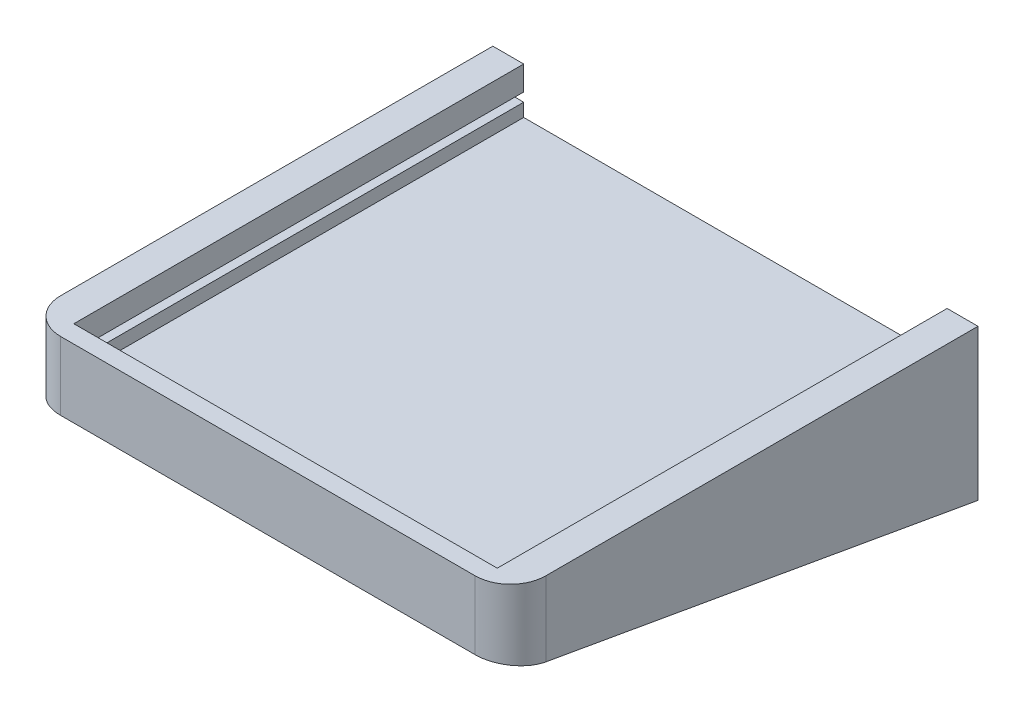
ISO-10303-21;
HEADER;
FILE_DESCRIPTION(('STEP AP214'),'2;1');
FILE_NAME('part.step','',(''),(''),'','','');
FILE_SCHEMA(('AUTOMOTIVE_DESIGN { 1 0 10303 214 1 1 1 1 }'));
ENDSEC;
DATA;
#1=APPLICATION_CONTEXT('core data for automotive mechanical design processes');
#2=APPLICATION_PROTOCOL_DEFINITION('international standard','automotive_design',2000,#1);
#3=PRODUCT_CONTEXT('',#1,'mechanical');
#4=PRODUCT('Part','Part','',(#3));
#5=PRODUCT_RELATED_PRODUCT_CATEGORY('part','',(#4));
#6=PRODUCT_DEFINITION_FORMATION('','',#4);
#7=PRODUCT_DEFINITION_CONTEXT('part definition',#1,'design');
#8=PRODUCT_DEFINITION('design','',#6,#7);
#9=PRODUCT_DEFINITION_SHAPE('','',#8);
#10=(LENGTH_UNIT() NAMED_UNIT(*) SI_UNIT(.MILLI.,.METRE.));
#11=(NAMED_UNIT(*) PLANE_ANGLE_UNIT() SI_UNIT($,.RADIAN.));
#12=(NAMED_UNIT(*) SI_UNIT($,.STERADIAN.) SOLID_ANGLE_UNIT());
#13=UNCERTAINTY_MEASURE_WITH_UNIT(LENGTH_MEASURE(1.E-05),#10,'distance_accuracy_value','');
#14=(GEOMETRIC_REPRESENTATION_CONTEXT(3) GLOBAL_UNCERTAINTY_ASSIGNED_CONTEXT((#13)) GLOBAL_UNIT_ASSIGNED_CONTEXT((#10,
#11,#12)) REPRESENTATION_CONTEXT('',''));
#15=CARTESIAN_POINT('',(0.,0.,0.));
#16=DIRECTION('',(0.,0.,1.));
#17=DIRECTION('',(1.,0.,0.));
#18=AXIS2_PLACEMENT_3D('',#15,#16,#17);
#19=CARTESIAN_POINT('',(0.,8.,0.));
#20=DIRECTION('',(0.,1.,0.));
#21=DIRECTION('',(0.,0.,1.));
#22=AXIS2_PLACEMENT_3D('',#19,#20,#21);
#23=PLANE('',#22);
#24=DIRECTION('',(-1.,0.,0.));
#25=VECTOR('',#24,1.);
#26=CARTESIAN_POINT('',(0.,8.,-106.));
#27=LINE('',#26,#25);
#28=CARTESIAN_POINT('',(7.00000000000001,8.,-106.));
#29=VERTEX_POINT('',#28);
#30=CARTESIAN_POINT('',(4.00000000000002,8.,-106.));
#31=VERTEX_POINT('',#30);
#32=EDGE_CURVE('E376',#29,#31,#27,.T.);
#33=ORIENTED_EDGE('',*,*,#32,.T.);
#34=DIRECTION('',(0.,0.,1.));
#35=VECTOR('',#34,1.);
#36=CARTESIAN_POINT('',(4.00000000000001,8.,-106.));
#37=LINE('',#36,#35);
#38=CARTESIAN_POINT('',(4.00000000000002,8.,-4.));
#39=VERTEX_POINT('',#38);
#40=EDGE_CURVE('E343',#31,#39,#37,.T.);
#41=ORIENTED_EDGE('',*,*,#40,.T.);
#42=DIRECTION('',(1.,0.,0.));
#43=VECTOR('',#42,1.);
#44=CARTESIAN_POINT('',(4.00000000000002,8.,-4.));
#45=LINE('',#44,#43);
#46=CARTESIAN_POINT('',(7.00000000000001,8.,-4.));
#47=VERTEX_POINT('',#46);
#48=EDGE_CURVE('E353',#39,#47,#45,.T.);
#49=ORIENTED_EDGE('',*,*,#48,.T.);
#50=DIRECTION('',(0.,0.,1.));
#51=VECTOR('',#50,1.);
#52=CARTESIAN_POINT('',(7.00000000000001,8.,0.));
#53=LINE('',#52,#51);
#54=EDGE_CURVE('E372',#29,#47,#53,.T.);
#55=ORIENTED_EDGE('',*,*,#54,.F.);
#56=EDGE_LOOP('',(#33,#41,#49,#55));
#57=FACE_BOUND('',#56,.T.);
#58=ADVANCED_FACE('F43',(#57),#23,.T.);
#59=DIRECTION('',(0.,0.,-1.));
#60=VECTOR('',#59,1.);
#61=CARTESIAN_POINT('',(103.,8.,0.));
#62=LINE('',#61,#60);
#63=CARTESIAN_POINT('',(103.,8.,-4.));
#64=VERTEX_POINT('',#63);
#65=CARTESIAN_POINT('',(103.,8.,-106.));
#66=VERTEX_POINT('',#65);
#67=EDGE_CURVE('E369',#64,#66,#62,.T.);
#68=ORIENTED_EDGE('',*,*,#67,.F.);
#69=CARTESIAN_POINT('',(106.,8.,-4.));
#70=VERTEX_POINT('',#69);
#71=EDGE_CURVE('E355',#64,#70,#45,.T.);
#72=ORIENTED_EDGE('',*,*,#71,.T.);
#73=DIRECTION('',(0.,0.,1.));
#74=VECTOR('',#73,1.);
#75=CARTESIAN_POINT('',(106.,8.,-106.));
#76=LINE('',#75,#74);
#77=CARTESIAN_POINT('',(106.,8.,-106.));
#78=VERTEX_POINT('',#77);
#79=EDGE_CURVE('E339',#78,#70,#76,.T.);
#80=ORIENTED_EDGE('',*,*,#79,.F.);
#81=EDGE_CURVE('E378',#78,#66,#27,.T.);
#82=ORIENTED_EDGE('',*,*,#81,.T.);
#83=EDGE_LOOP('',(#68,#72,#80,#82));
#84=FACE_BOUND('',#83,.T.);
#85=ADVANCED_FACE('F461',(#84),#23,.T.);
#86=CARTESIAN_POINT('',(0.,5.,0.));
#87=DIRECTION('',(1.,0.,0.));
#88=DIRECTION('',(0.,0.,-1.));
#89=AXIS2_PLACEMENT_3D('',#86,#87,#88);
#90=PLANE('',#89);
#91=DIRECTION('',(0.,-0.173648177666923,-0.984807753012209));
#92=VECTOR('',#91,1.);
#93=CARTESIAN_POINT('',(0.,-18.6906599550965,-106.));
#94=LINE('',#93,#92);
#95=CARTESIAN_POINT('',(0.,-1.41061584566766,-7.99999999999999));
#96=VERTEX_POINT('',#95);
#97=CARTESIAN_POINT('',(0.,-18.6906599550965,-106.));
#98=VERTEX_POINT('',#97);
#99=EDGE_CURVE('E294',#96,#98,#94,.T.);
#100=ORIENTED_EDGE('',*,*,#99,.F.);
#101=DIRECTION('',(0.,-1.,0.));
#102=VECTOR('',#101,1.);
#103=CARTESIAN_POINT('',(0.,5.,-8.));
#104=LINE('',#103,#102);
#105=CARTESIAN_POINT('',(0.,15.5,-7.99999999999999));
#106=VERTEX_POINT('',#105);
#107=EDGE_CURVE('E67',#96,#106,#104,.F.);
#108=ORIENTED_EDGE('',*,*,#107,.T.);
#109=DIRECTION('',(0.,0.,1.));
#110=VECTOR('',#109,1.);
#111=CARTESIAN_POINT('',(0.,15.5,-106.));
#112=LINE('',#111,#110);
#113=CARTESIAN_POINT('',(0.,15.5,-106.));
#114=VERTEX_POINT('',#113);
#115=EDGE_CURVE('E301',#114,#106,#112,.T.);
#116=ORIENTED_EDGE('',*,*,#115,.F.);
#117=DIRECTION('',(0.,-1.,0.));
#118=VECTOR('',#117,1.);
#119=CARTESIAN_POINT('',(0.,5.,-106.));
#120=LINE('',#119,#118);
#121=EDGE_CURVE('E399',#114,#98,#120,.T.);
#122=ORIENTED_EDGE('',*,*,#121,.T.);
#123=EDGE_LOOP('',(#100,#108,#116,#122));
#124=FACE_BOUND('',#123,.T.);
#125=ADVANCED_FACE('F468',(#124),#90,.F.);
#126=CARTESIAN_POINT('',(0.,5.,0.));
#127=DIRECTION('',(0.,0.,-1.));
#128=DIRECTION('',(-1.,0.,0.));
#129=AXIS2_PLACEMENT_3D('',#126,#127,#128);
#130=PLANE('',#129);
#131=DIRECTION('',(1.,0.,0.));
#132=VECTOR('',#131,1.);
#133=CARTESIAN_POINT('',(0.,0.,0.));
#134=LINE('',#133,#132);
#135=CARTESIAN_POINT('',(8.,0.,0.));
#136=VERTEX_POINT('',#135);
#137=CARTESIAN_POINT('',(102.,0.,0.));
#138=VERTEX_POINT('',#137);
#139=EDGE_CURVE('E395',#136,#138,#134,.T.);
#140=ORIENTED_EDGE('',*,*,#139,.T.);
#141=DIRECTION('',(0.,-1.,0.));
#142=VECTOR('',#141,1.);
#143=CARTESIAN_POINT('',(102.,5.,0.));
#144=LINE('',#143,#142);
#145=CARTESIAN_POINT('',(102.,15.5,0.));
#146=VERTEX_POINT('',#145);
#147=EDGE_CURVE('E417',#138,#146,#144,.F.);
#148=ORIENTED_EDGE('',*,*,#147,.T.);
#149=DIRECTION('',(1.,0.,0.));
#150=VECTOR('',#149,1.);
#151=CARTESIAN_POINT('',(110.,15.5,0.));
#152=LINE('',#151,#150);
#153=CARTESIAN_POINT('',(7.99999999999999,15.5,0.));
#154=VERTEX_POINT('',#153);
#155=EDGE_CURVE('E303',#154,#146,#152,.T.);
#156=ORIENTED_EDGE('',*,*,#155,.F.);
#157=DIRECTION('',(0.,-1.,0.));
#158=VECTOR('',#157,1.);
#159=CARTESIAN_POINT('',(8.,5.,0.));
#160=LINE('',#159,#158);
#161=EDGE_CURVE('E414',#154,#136,#160,.T.);
#162=ORIENTED_EDGE('',*,*,#161,.T.);
#163=EDGE_LOOP('',(#140,#148,#156,#162));
#164=FACE_BOUND('',#163,.T.);
#165=ADVANCED_FACE('F494',(#164),#130,.F.);
#166=CARTESIAN_POINT('',(110.,5.,0.));
#167=DIRECTION('',(-1.,0.,0.));
#168=DIRECTION('',(0.,0.,1.));
#169=AXIS2_PLACEMENT_3D('',#166,#167,#168);
#170=PLANE('',#169);
#171=DIRECTION('',(0.,0.,-1.));
#172=VECTOR('',#171,1.);
#173=CARTESIAN_POINT('',(110.,15.5,0.));
#174=LINE('',#173,#172);
#175=CARTESIAN_POINT('',(110.,15.5,-8.));
#176=VERTEX_POINT('',#175);
#177=CARTESIAN_POINT('',(110.,15.5,-106.));
#178=VERTEX_POINT('',#177);
#179=EDGE_CURVE('E307',#176,#178,#174,.T.);
#180=ORIENTED_EDGE('',*,*,#179,.F.);
#181=DIRECTION('',(0.,-1.,0.));
#182=VECTOR('',#181,1.);
#183=CARTESIAN_POINT('',(110.,5.,-8.));
#184=LINE('',#183,#182);
#185=CARTESIAN_POINT('',(110.,-1.41061584566766,-7.99999999999999));
#186=VERTEX_POINT('',#185);
#187=EDGE_CURVE('E407',#176,#186,#184,.T.);
#188=ORIENTED_EDGE('',*,*,#187,.T.);
#189=DIRECTION('',(0.,-0.173648177666923,-0.984807753012209));
#190=VECTOR('',#189,1.);
#191=CARTESIAN_POINT('',(110.,-18.6906599550965,-106.));
#192=LINE('',#191,#190);
#193=CARTESIAN_POINT('',(110.,-18.6906599550965,-106.));
#194=VERTEX_POINT('',#193);
#195=EDGE_CURVE('E291',#186,#194,#192,.T.);
#196=ORIENTED_EDGE('',*,*,#195,.T.);
#197=DIRECTION('',(0.,-1.,0.));
#198=VECTOR('',#197,1.);
#199=CARTESIAN_POINT('',(110.,5.,-106.));
#200=LINE('',#199,#198);
#201=EDGE_CURVE('E404',#178,#194,#200,.T.);
#202=ORIENTED_EDGE('',*,*,#201,.F.);
#203=EDGE_LOOP('',(#180,#188,#196,#202));
#204=FACE_BOUND('',#203,.T.);
#205=ADVANCED_FACE('F491',(#204),#170,.F.);
#206=CARTESIAN_POINT('',(0.,5.,-106.));
#207=DIRECTION('',(0.,0.,1.));
#208=DIRECTION('',(1.,0.,0.));
#209=AXIS2_PLACEMENT_3D('',#206,#207,#208);
#210=PLANE('',#209);
#211=CARTESIAN_POINT('',(103.,0.,-106.));
#212=DIRECTION('',(0.,0.,1.));
#213=DIRECTION('',(1.,0.,0.));
#214=AXIS2_PLACEMENT_3D('',#211,#212,#213);
#215=CIRCLE('',#214,2.85000000000001);
#216=CARTESIAN_POINT('',(105.85,0.,-106.));
#217=VERTEX_POINT('',#216);
#218=EDGE_CURVE('E52',#217,#217,#215,.T.);
#219=ORIENTED_EDGE('',*,*,#218,.T.);
#220=EDGE_LOOP('',(#219));
#221=FACE_BOUND('',#220,.T.);
#222=CARTESIAN_POINT('',(7.00000000000001,0.,-106.));
#223=DIRECTION('',(0.,0.,1.));
#224=DIRECTION('',(1.,0.,0.));
#225=AXIS2_PLACEMENT_3D('',#222,#223,#224);
#226=CIRCLE('',#225,2.85000000000001);
#227=CARTESIAN_POINT('',(9.85000000000001,0.,-106.));
#228=VERTEX_POINT('',#227);
#229=EDGE_CURVE('E427',#228,#228,#226,.T.);
#230=ORIENTED_EDGE('',*,*,#229,.T.);
#231=EDGE_LOOP('',(#230));
#232=FACE_BOUND('',#231,.T.);
#233=ORIENTED_EDGE('',*,*,#201,.T.);
#234=DIRECTION('',(1.,0.,0.));
#235=VECTOR('',#234,1.);
#236=CARTESIAN_POINT('',(0.,-18.6906599550965,-106.));
#237=LINE('',#236,#235);
#238=EDGE_CURVE('E296',#98,#194,#237,.T.);
#239=ORIENTED_EDGE('',*,*,#238,.F.);
#240=ORIENTED_EDGE('',*,*,#121,.F.);
#241=DIRECTION('',(-1.,0.,0.));
#242=VECTOR('',#241,1.);
#243=CARTESIAN_POINT('',(0.,15.5,-106.));
#244=LINE('',#243,#242);
#245=CARTESIAN_POINT('',(7.00000000000001,15.5,-106.));
#246=VERTEX_POINT('',#245);
#247=EDGE_CURVE('E317',#246,#114,#244,.T.);
#248=ORIENTED_EDGE('',*,*,#247,.F.);
#249=DIRECTION('',(0.,-1.,0.));
#250=VECTOR('',#249,1.);
#251=CARTESIAN_POINT('',(7.00000000000001,15.5,-106.));
#252=LINE('',#251,#250);
#253=CARTESIAN_POINT('',(7.00000000000001,10.,-106.));
#254=VERTEX_POINT('',#253);
#255=EDGE_CURVE('E320',#246,#254,#252,.T.);
#256=ORIENTED_EDGE('',*,*,#255,.T.);
#257=DIRECTION('',(-1.,0.,0.));
#258=VECTOR('',#257,1.);
#259=CARTESIAN_POINT('',(0.,10.,-106.));
#260=LINE('',#259,#258);
#261=CARTESIAN_POINT('',(4.00000000000002,10.,-106.));
#262=VERTEX_POINT('',#261);
#263=EDGE_CURVE('E304',#254,#262,#260,.T.);
#264=ORIENTED_EDGE('',*,*,#263,.T.);
#265=DIRECTION('',(0.,-1.,0.));
#266=VECTOR('',#265,1.);
#267=CARTESIAN_POINT('',(4.00000000000001,10.,-106.));
#268=LINE('',#267,#266);
#269=EDGE_CURVE('E350',#262,#31,#268,.T.);
#270=ORIENTED_EDGE('',*,*,#269,.T.);
#271=ORIENTED_EDGE('',*,*,#32,.F.);
#272=DIRECTION('',(0.,-1.,0.));
#273=VECTOR('',#272,1.);
#274=CARTESIAN_POINT('',(7.00000000000001,8.,-106.));
#275=LINE('',#274,#273);
#276=CARTESIAN_POINT('',(7.00000000000001,5.,-106.));
#277=VERTEX_POINT('',#276);
#278=EDGE_CURVE('E388',#29,#277,#275,.T.);
#279=ORIENTED_EDGE('',*,*,#278,.T.);
#280=DIRECTION('',(-1.,0.,0.));
#281=VECTOR('',#280,1.);
#282=CARTESIAN_POINT('',(0.,5.,-106.));
#283=LINE('',#282,#281);
#284=CARTESIAN_POINT('',(103.,5.,-106.));
#285=VERTEX_POINT('',#284);
#286=EDGE_CURVE('E396',#285,#277,#283,.T.);
#287=ORIENTED_EDGE('',*,*,#286,.F.);
#288=DIRECTION('',(0.,-1.,0.));
#289=VECTOR('',#288,1.);
#290=CARTESIAN_POINT('',(103.,8.,-106.));
#291=LINE('',#290,#289);
#292=EDGE_CURVE('E386',#66,#285,#291,.T.);
#293=ORIENTED_EDGE('',*,*,#292,.F.);
#294=ORIENTED_EDGE('',*,*,#81,.F.);
#295=DIRECTION('',(0.,-1.,0.));
#296=VECTOR('',#295,1.);
#297=CARTESIAN_POINT('',(106.,10.,-106.));
#298=LINE('',#297,#296);
#299=CARTESIAN_POINT('',(106.,10.,-106.));
#300=VERTEX_POINT('',#299);
#301=EDGE_CURVE('E365',#300,#78,#298,.T.);
#302=ORIENTED_EDGE('',*,*,#301,.F.);
#303=DIRECTION('',(-1.,0.,0.));
#304=VECTOR('',#303,1.);
#305=CARTESIAN_POINT('',(103.,10.,-106.));
#306=LINE('',#305,#304);
#307=CARTESIAN_POINT('',(103.,10.,-106.));
#308=VERTEX_POINT('',#307);
#309=EDGE_CURVE('E300',#300,#308,#306,.T.);
#310=ORIENTED_EDGE('',*,*,#309,.T.);
#311=DIRECTION('',(0.,-1.,0.));
#312=VECTOR('',#311,1.);
#313=CARTESIAN_POINT('',(103.,15.5,-106.));
#314=LINE('',#313,#312);
#315=CARTESIAN_POINT('',(103.,15.5,-106.));
#316=VERTEX_POINT('',#315);
#317=EDGE_CURVE('E336',#316,#308,#314,.T.);
#318=ORIENTED_EDGE('',*,*,#317,.F.);
#319=DIRECTION('',(-1.,0.,0.));
#320=VECTOR('',#319,1.);
#321=CARTESIAN_POINT('',(103.,15.5,-106.));
#322=LINE('',#321,#320);
#323=EDGE_CURVE('E309',#178,#316,#322,.T.);
#324=ORIENTED_EDGE('',*,*,#323,.F.);
#325=EDGE_LOOP('',(#233,#239,#240,#248,#256,#264,#270,#271,#279,#287,#293,#294,#302,#310,#318,#324));
#326=FACE_BOUND('',#325,.T.);
#327=ADVANCED_FACE('F432',(#221,#232,#326),#210,.F.);
#328=CARTESIAN_POINT('',(0.,5.,0.));
#329=DIRECTION('',(0.,-1.,0.));
#330=DIRECTION('',(0.,0.,-1.));
#331=AXIS2_PLACEMENT_3D('',#328,#329,#330);
#332=PLANE('',#331);
#333=DIRECTION('',(1.,0.,0.));
#334=VECTOR('',#333,1.);
#335=CARTESIAN_POINT('',(0.,5.,-4.));
#336=LINE('',#335,#334);
#337=CARTESIAN_POINT('',(7.00000000000001,5.,-4.));
#338=VERTEX_POINT('',#337);
#339=CARTESIAN_POINT('',(103.,5.,-4.));
#340=VERTEX_POINT('',#339);
#341=EDGE_CURVE('E381',#338,#340,#336,.T.);
#342=ORIENTED_EDGE('',*,*,#341,.T.);
#343=DIRECTION('',(0.,0.,-1.));
#344=VECTOR('',#343,1.);
#345=CARTESIAN_POINT('',(103.,5.,0.));
#346=LINE('',#345,#344);
#347=EDGE_CURVE('E368',#340,#285,#346,.T.);
#348=ORIENTED_EDGE('',*,*,#347,.T.);
#349=ORIENTED_EDGE('',*,*,#286,.T.);
#350=DIRECTION('',(0.,0.,1.));
#351=VECTOR('',#350,1.);
#352=CARTESIAN_POINT('',(7.00000000000001,5.,0.));
#353=LINE('',#352,#351);
#354=EDGE_CURVE('E373',#277,#338,#353,.T.);
#355=ORIENTED_EDGE('',*,*,#354,.T.);
#356=EDGE_LOOP('',(#342,#348,#349,#355));
#357=FACE_BOUND('',#356,.T.);
#358=ADVANCED_FACE('F485',(#357),#332,.F.);
#359=CARTESIAN_POINT('',(103.,8.,0.));
#360=DIRECTION('',(-1.,0.,0.));
#361=DIRECTION('',(0.,0.,1.));
#362=AXIS2_PLACEMENT_3D('',#359,#360,#361);
#363=PLANE('',#362);
#364=ORIENTED_EDGE('',*,*,#347,.F.);
#365=DIRECTION('',(0.,-1.,0.));
#366=VECTOR('',#365,1.);
#367=CARTESIAN_POINT('',(103.,8.,-4.));
#368=LINE('',#367,#366);
#369=EDGE_CURVE('E392',#64,#340,#368,.T.);
#370=ORIENTED_EDGE('',*,*,#369,.F.);
#371=ORIENTED_EDGE('',*,*,#67,.T.);
#372=ORIENTED_EDGE('',*,*,#292,.T.);
#373=EDGE_LOOP('',(#364,#370,#371,#372));
#374=FACE_BOUND('',#373,.T.);
#375=ADVANCED_FACE('F481',(#374),#363,.T.);
#376=CARTESIAN_POINT('',(0.,8.,-4.));
#377=DIRECTION('',(0.,0.,-1.));
#378=DIRECTION('',(-1.,0.,0.));
#379=AXIS2_PLACEMENT_3D('',#376,#377,#378);
#380=PLANE('',#379);
#381=ORIENTED_EDGE('',*,*,#341,.F.);
#382=DIRECTION('',(0.,-1.,0.));
#383=VECTOR('',#382,1.);
#384=CARTESIAN_POINT('',(7.00000000000001,8.,-4.));
#385=LINE('',#384,#383);
#386=EDGE_CURVE('E390',#47,#338,#385,.T.);
#387=ORIENTED_EDGE('',*,*,#386,.F.);
#388=ORIENTED_EDGE('',*,*,#48,.F.);
#389=DIRECTION('',(0.,-1.,0.));
#390=VECTOR('',#389,1.);
#391=CARTESIAN_POINT('',(4.00000000000002,10.,-4.));
#392=LINE('',#391,#390);
#393=CARTESIAN_POINT('',(4.00000000000002,10.,-4.));
#394=VERTEX_POINT('',#393);
#395=EDGE_CURVE('E359',#394,#39,#392,.T.);
#396=ORIENTED_EDGE('',*,*,#395,.F.);
#397=DIRECTION('',(1.,0.,0.));
#398=VECTOR('',#397,1.);
#399=CARTESIAN_POINT('',(4.00000000000002,10.,-4.));
#400=LINE('',#399,#398);
#401=CARTESIAN_POINT('',(7.00000000000001,10.,-4.));
#402=VERTEX_POINT('',#401);
#403=EDGE_CURVE('E344',#394,#402,#400,.T.);
#404=ORIENTED_EDGE('',*,*,#403,.T.);
#405=DIRECTION('',(0.,-1.,0.));
#406=VECTOR('',#405,1.);
#407=CARTESIAN_POINT('',(7.00000000000001,15.5,-4.));
#408=LINE('',#407,#406);
#409=CARTESIAN_POINT('',(7.00000000000001,15.5,-4.));
#410=VERTEX_POINT('',#409);
#411=EDGE_CURVE('E331',#410,#402,#408,.T.);
#412=ORIENTED_EDGE('',*,*,#411,.F.);
#413=DIRECTION('',(-1.,0.,0.));
#414=VECTOR('',#413,1.);
#415=CARTESIAN_POINT('',(103.,15.5,-4.));
#416=LINE('',#415,#414);
#417=CARTESIAN_POINT('',(103.,15.5,-4.));
#418=VERTEX_POINT('',#417);
#419=EDGE_CURVE('E313',#418,#410,#416,.T.);
#420=ORIENTED_EDGE('',*,*,#419,.F.);
#421=DIRECTION('',(0.,-1.,0.));
#422=VECTOR('',#421,1.);
#423=CARTESIAN_POINT('',(103.,15.5,-4.));
#424=LINE('',#423,#422);
#425=CARTESIAN_POINT('',(103.,10.,-4.));
#426=VERTEX_POINT('',#425);
#427=EDGE_CURVE('E333',#418,#426,#424,.T.);
#428=ORIENTED_EDGE('',*,*,#427,.T.);
#429=CARTESIAN_POINT('',(106.,10.,-4.));
#430=VERTEX_POINT('',#429);
#431=EDGE_CURVE('E342',#426,#430,#400,.T.);
#432=ORIENTED_EDGE('',*,*,#431,.T.);
#433=DIRECTION('',(0.,-1.,0.));
#434=VECTOR('',#433,1.);
#435=CARTESIAN_POINT('',(106.,10.,-4.));
#436=LINE('',#435,#434);
#437=EDGE_CURVE('E362',#430,#70,#436,.T.);
#438=ORIENTED_EDGE('',*,*,#437,.T.);
#439=ORIENTED_EDGE('',*,*,#71,.F.);
#440=ORIENTED_EDGE('',*,*,#369,.T.);
#441=EDGE_LOOP('',(#381,#387,#388,#396,#404,#412,#420,#428,#432,#438,#439,#440));
#442=FACE_BOUND('',#441,.T.);
#443=ADVANCED_FACE('F477',(#442),#380,.T.);
#444=CARTESIAN_POINT('',(7.00000000000001,8.,0.));
#445=DIRECTION('',(1.,0.,0.));
#446=DIRECTION('',(0.,0.,-1.));
#447=AXIS2_PLACEMENT_3D('',#444,#445,#446);
#448=PLANE('',#447);
#449=ORIENTED_EDGE('',*,*,#354,.F.);
#450=ORIENTED_EDGE('',*,*,#278,.F.);
#451=ORIENTED_EDGE('',*,*,#54,.T.);
#452=ORIENTED_EDGE('',*,*,#386,.T.);
#453=EDGE_LOOP('',(#449,#450,#451,#452));
#454=FACE_BOUND('',#453,.T.);
#455=ADVANCED_FACE('F474',(#454),#448,.T.);
#456=CARTESIAN_POINT('',(106.,10.,-106.));
#457=DIRECTION('',(1.,0.,0.));
#458=DIRECTION('',(0.,0.,-1.));
#459=AXIS2_PLACEMENT_3D('',#456,#457,#458);
#460=PLANE('',#459);
#461=ORIENTED_EDGE('',*,*,#79,.T.);
#462=ORIENTED_EDGE('',*,*,#437,.F.);
#463=DIRECTION('',(0.,0.,1.));
#464=VECTOR('',#463,1.);
#465=CARTESIAN_POINT('',(106.,10.,-106.));
#466=LINE('',#465,#464);
#467=EDGE_CURVE('E340',#300,#430,#466,.T.);
#468=ORIENTED_EDGE('',*,*,#467,.F.);
#469=ORIENTED_EDGE('',*,*,#301,.T.);
#470=EDGE_LOOP('',(#461,#462,#468,#469));
#471=FACE_BOUND('',#470,.T.);
#472=ADVANCED_FACE('F472',(#471),#460,.F.);
#473=CARTESIAN_POINT('',(4.00000000000001,10.,-106.));
#474=DIRECTION('',(1.,0.,0.));
#475=DIRECTION('',(0.,0.,-1.));
#476=AXIS2_PLACEMENT_3D('',#473,#474,#475);
#477=PLANE('',#476);
#478=ORIENTED_EDGE('',*,*,#40,.F.);
#479=ORIENTED_EDGE('',*,*,#269,.F.);
#480=DIRECTION('',(0.,0.,1.));
#481=VECTOR('',#480,1.);
#482=CARTESIAN_POINT('',(4.00000000000001,10.,-106.));
#483=LINE('',#482,#481);
#484=EDGE_CURVE('E347',#262,#394,#483,.T.);
#485=ORIENTED_EDGE('',*,*,#484,.T.);
#486=ORIENTED_EDGE('',*,*,#395,.T.);
#487=EDGE_LOOP('',(#478,#479,#485,#486));
#488=FACE_BOUND('',#487,.T.);
#489=ADVANCED_FACE('F566',(#488),#477,.T.);
#490=CARTESIAN_POINT('',(0.,10.,0.));
#491=DIRECTION('',(0.,-1.,0.));
#492=DIRECTION('',(0.,0.,-1.));
#493=AXIS2_PLACEMENT_3D('',#490,#491,#492);
#494=PLANE('',#493);
#495=ORIENTED_EDGE('',*,*,#403,.F.);
#496=ORIENTED_EDGE('',*,*,#484,.F.);
#497=ORIENTED_EDGE('',*,*,#263,.F.);
#498=DIRECTION('',(0.,0.,-1.));
#499=VECTOR('',#498,1.);
#500=CARTESIAN_POINT('',(7.00000000000001,10.,-106.));
#501=LINE('',#500,#499);
#502=EDGE_CURVE('E325',#402,#254,#501,.T.);
#503=ORIENTED_EDGE('',*,*,#502,.F.);
#504=EDGE_LOOP('',(#495,#496,#497,#503));
#505=FACE_BOUND('',#504,.T.);
#506=ADVANCED_FACE('F558',(#505),#494,.T.);
#507=CARTESIAN_POINT('',(103.,15.5,-4.));
#508=DIRECTION('',(1.,0.,0.));
#509=DIRECTION('',(0.,0.,-1.));
#510=AXIS2_PLACEMENT_3D('',#507,#508,#509);
#511=PLANE('',#510);
#512=DIRECTION('',(0.,0.,1.));
#513=VECTOR('',#512,1.);
#514=CARTESIAN_POINT('',(103.,10.,-4.));
#515=LINE('',#514,#513);
#516=EDGE_CURVE('E322',#308,#426,#515,.T.);
#517=ORIENTED_EDGE('',*,*,#516,.T.);
#518=ORIENTED_EDGE('',*,*,#427,.F.);
#519=DIRECTION('',(0.,0.,1.));
#520=VECTOR('',#519,1.);
#521=CARTESIAN_POINT('',(103.,15.5,-4.));
#522=LINE('',#521,#520);
#523=EDGE_CURVE('E311',#316,#418,#522,.T.);
#524=ORIENTED_EDGE('',*,*,#523,.F.);
#525=ORIENTED_EDGE('',*,*,#317,.T.);
#526=EDGE_LOOP('',(#517,#518,#524,#525));
#527=FACE_BOUND('',#526,.T.);
#528=ADVANCED_FACE('F533',(#527),#511,.F.);
#529=CARTESIAN_POINT('',(7.00000000000001,15.5,-106.));
#530=DIRECTION('',(-1.,0.,0.));
#531=DIRECTION('',(0.,0.,1.));
#532=AXIS2_PLACEMENT_3D('',#529,#530,#531);
#533=PLANE('',#532);
#534=ORIENTED_EDGE('',*,*,#502,.T.);
#535=ORIENTED_EDGE('',*,*,#255,.F.);
#536=DIRECTION('',(0.,0.,-1.));
#537=VECTOR('',#536,1.);
#538=CARTESIAN_POINT('',(7.00000000000001,15.5,-106.));
#539=LINE('',#538,#537);
#540=EDGE_CURVE('E315',#410,#246,#539,.T.);
#541=ORIENTED_EDGE('',*,*,#540,.F.);
#542=ORIENTED_EDGE('',*,*,#411,.T.);
#543=EDGE_LOOP('',(#534,#535,#541,#542));
#544=FACE_BOUND('',#543,.T.);
#545=ADVANCED_FACE('F542',(#544),#533,.F.);
#546=CARTESIAN_POINT('',(0.,15.5,0.));
#547=DIRECTION('',(0.,-1.,0.));
#548=DIRECTION('',(0.,0.,-1.));
#549=AXIS2_PLACEMENT_3D('',#546,#547,#548);
#550=PLANE('',#549);
#551=ORIENTED_EDGE('',*,*,#155,.T.);
#552=CARTESIAN_POINT('',(102.,15.5,-8.));
#553=DIRECTION('',(0.,-1.,0.));
#554=DIRECTION('',(0.,0.,-1.));
#555=AXIS2_PLACEMENT_3D('',#552,#553,#554);
#556=CIRCLE('',#555,8.);
#557=EDGE_CURVE('E421',#146,#176,#556,.F.);
#558=ORIENTED_EDGE('',*,*,#557,.T.);
#559=ORIENTED_EDGE('',*,*,#179,.T.);
#560=ORIENTED_EDGE('',*,*,#323,.T.);
#561=ORIENTED_EDGE('',*,*,#523,.T.);
#562=ORIENTED_EDGE('',*,*,#419,.T.);
#563=ORIENTED_EDGE('',*,*,#540,.T.);
#564=ORIENTED_EDGE('',*,*,#247,.T.);
#565=ORIENTED_EDGE('',*,*,#115,.T.);
#566=CARTESIAN_POINT('',(8.,15.5,-8.));
#567=DIRECTION('',(0.,-1.,0.));
#568=DIRECTION('',(0.,0.,-1.));
#569=AXIS2_PLACEMENT_3D('',#566,#567,#568);
#570=CIRCLE('',#569,8.);
#571=EDGE_CURVE('E419',#106,#154,#570,.F.);
#572=ORIENTED_EDGE('',*,*,#571,.T.);
#573=EDGE_LOOP('',(#551,#558,#559,#560,#561,#562,#563,#564,#565,#572));
#574=FACE_BOUND('',#573,.T.);
#575=ADVANCED_FACE('F516',(#574),#550,.F.);
#576=ORIENTED_EDGE('',*,*,#309,.F.);
#577=ORIENTED_EDGE('',*,*,#467,.T.);
#578=ORIENTED_EDGE('',*,*,#431,.F.);
#579=ORIENTED_EDGE('',*,*,#516,.F.);
#580=EDGE_LOOP('',(#576,#577,#578,#579));
#581=FACE_BOUND('',#580,.T.);
#582=ADVANCED_FACE('F547',(#581),#494,.T.);
#583=CARTESIAN_POINT('',(0.,-18.6906599550965,-106.));
#584=DIRECTION('',(0.,-0.984807753012209,0.173648177666924));
#585=DIRECTION('',(0.,-0.173648177666923,-0.984807753012209));
#586=AXIS2_PLACEMENT_3D('',#583,#584,#585);
#587=PLANE('',#586);
#588=CARTESIAN_POINT('',(14.,-2.43107448733693,-13.7873085421709));
#589=DIRECTION('',(0.,-0.984807753012209,0.173648177666923));
#590=DIRECTION('',(0.,-0.173648177666923,-0.984807753012209));
#591=AXIS2_PLACEMENT_3D('',#588,#589,#590);
#592=CIRCLE('',#591,6.);
#593=CARTESIAN_POINT('',(14.,-1.38918542133539,-7.87846202409767));
#594=VERTEX_POINT('',#593);
#595=CARTESIAN_POINT('',(8.,-2.43107448733693,-13.7873085421709));
#596=VERTEX_POINT('',#595);
#597=EDGE_CURVE('E59',#594,#596,#592,.T.);
#598=ORIENTED_EDGE('',*,*,#597,.F.);
#599=DIRECTION('',(1.,0.,0.));
#600=VECTOR('',#599,1.);
#601=CARTESIAN_POINT('',(14.,-1.38918542133539,-7.87846202409767));
#602=LINE('',#601,#600);
#603=CARTESIAN_POINT('',(96.,-1.38918542133539,-7.87846202409767));
#604=VERTEX_POINT('',#603);
#605=EDGE_CURVE('E239',#594,#604,#602,.T.);
#606=ORIENTED_EDGE('',*,*,#605,.T.);
#607=CARTESIAN_POINT('',(96.,-2.43107448733693,-13.7873085421709));
#608=DIRECTION('',(0.,0.984807753012209,-0.173648177666923));
#609=DIRECTION('',(0.,0.173648177666923,0.984807753012209));
#610=AXIS2_PLACEMENT_3D('',#607,#608,#609);
#611=CIRCLE('',#610,6.);
#612=CARTESIAN_POINT('',(102.,-2.43107448733693,-13.7873085421709));
#613=VERTEX_POINT('',#612);
#614=EDGE_CURVE('E242',#604,#613,#611,.T.);
#615=ORIENTED_EDGE('',*,*,#614,.T.);
#616=DIRECTION('',(0.,-0.173648177666923,-0.984807753012209));
#617=VECTOR('',#616,1.);
#618=CARTESIAN_POINT('',(102.,-2.43107448733693,-13.7873085421709));
#619=LINE('',#618,#617);
#620=CARTESIAN_POINT('',(102.,-16.9541781784273,-96.1519224698779));
#621=VERTEX_POINT('',#620);
#622=EDGE_CURVE('E269',#613,#621,#619,.T.);
#623=ORIENTED_EDGE('',*,*,#622,.T.);
#624=CARTESIAN_POINT('',(96.,-16.9541781784273,-96.1519224698779));
#625=DIRECTION('',(0.,-0.984807753012209,0.173648177666923));
#626=DIRECTION('',(0.,-0.173648177666923,-0.984807753012209));
#627=AXIS2_PLACEMENT_3D('',#624,#625,#626);
#628=CIRCLE('',#627,6.);
#629=CARTESIAN_POINT('',(96.,-17.9960672444288,-102.060768987951));
#630=VERTEX_POINT('',#629);
#631=EDGE_CURVE('E266',#630,#621,#628,.T.);
#632=ORIENTED_EDGE('',*,*,#631,.F.);
#633=DIRECTION('',(1.,0.,0.));
#634=VECTOR('',#633,1.);
#635=CARTESIAN_POINT('',(14.,-17.9960672444288,-102.060768987951));
#636=LINE('',#635,#634);
#637=CARTESIAN_POINT('',(14.,-17.9960672444288,-102.060768987951));
#638=VERTEX_POINT('',#637);
#639=EDGE_CURVE('E263',#638,#630,#636,.T.);
#640=ORIENTED_EDGE('',*,*,#639,.F.);
#641=CARTESIAN_POINT('',(14.,-16.9541781784273,-96.1519224698779));
#642=DIRECTION('',(0.,-0.984807753012209,0.173648177666923));
#643=DIRECTION('',(0.,-0.173648177666923,-0.984807753012209));
#644=AXIS2_PLACEMENT_3D('',#641,#642,#643);
#645=CIRCLE('',#644,6.);
#646=CARTESIAN_POINT('',(8.00000000000001,-16.9541781784273,-96.1519224698779));
#647=VERTEX_POINT('',#646);
#648=EDGE_CURVE('E260',#647,#638,#645,.T.);
#649=ORIENTED_EDGE('',*,*,#648,.F.);
#650=DIRECTION('',(0.,-0.173648177666923,-0.984807753012209));
#651=VECTOR('',#650,1.);
#652=CARTESIAN_POINT('',(8.,-2.43107448733693,-13.7873085421709));
#653=LINE('',#652,#651);
#654=EDGE_CURVE('E258',#596,#647,#653,.T.);
#655=ORIENTED_EDGE('',*,*,#654,.F.);
#656=EDGE_LOOP('',(#598,#606,#615,#623,#632,#640,#649,#655));
#657=FACE_BOUND('',#656,.T.);
#658=ORIENTED_EDGE('',*,*,#195,.F.);
#659=CARTESIAN_POINT('',(102.,-1.41061584566766,-8.));
#660=DIRECTION('',(0.,-0.984807753012209,0.173648177666924));
#661=DIRECTION('',(0.,-0.173648177666923,-0.984807753012209));
#662=AXIS2_PLACEMENT_3D('',#659,#660,#661);
#663=ELLIPSE('',#662,8.12341289508595,8.);
#664=EDGE_CURVE('E412',#186,#138,#663,.T.);
#665=ORIENTED_EDGE('',*,*,#664,.T.);
#666=ORIENTED_EDGE('',*,*,#139,.F.);
#667=CARTESIAN_POINT('',(8.,-1.41061584566766,-8.));
#668=DIRECTION('',(0.,-0.984807753012209,0.173648177666924));
#669=DIRECTION('',(0.,-0.173648177666923,-0.984807753012209));
#670=AXIS2_PLACEMENT_3D('',#667,#668,#669);
#671=ELLIPSE('',#670,8.12341289508595,8.);
#672=EDGE_CURVE('E410',#136,#96,#671,.T.);
#673=ORIENTED_EDGE('',*,*,#672,.T.);
#674=ORIENTED_EDGE('',*,*,#99,.T.);
#675=ORIENTED_EDGE('',*,*,#238,.T.);
#676=EDGE_LOOP('',(#658,#665,#666,#673,#674,#675));
#677=FACE_BOUND('',#676,.T.);
#678=ADVANCED_FACE('F545',(#657,#677),#587,.T.);
#679=CARTESIAN_POINT('',(7.00000000000001,0.,-94.));
#680=DIRECTION('',(0.,0.,-1.));
#681=DIRECTION('',(-1.,0.,0.));
#682=AXIS2_PLACEMENT_3D('',#679,#680,#681);
#683=CYLINDRICAL_SURFACE('',#682,2.35);
#684=CARTESIAN_POINT('',(7.00000000000001,0.,-105.5));
#685=DIRECTION('',(0.,0.,1.));
#686=DIRECTION('',(1.,0.,0.));
#687=AXIS2_PLACEMENT_3D('',#684,#685,#686);
#688=CIRCLE('',#687,2.35);
#689=CARTESIAN_POINT('',(9.35000000000001,0.,-105.5));
#690=VERTEX_POINT('',#689);
#691=EDGE_CURVE('E11',#690,#690,#688,.F.);
#692=ORIENTED_EDGE('',*,*,#691,.T.);
#693=EDGE_LOOP('',(#692));
#694=FACE_BOUND('',#693,.T.);
#695=CARTESIAN_POINT('',(7.00000000000001,0.,-94.));
#696=DIRECTION('',(0.,0.,-1.));
#697=DIRECTION('',(-1.,0.,0.));
#698=AXIS2_PLACEMENT_3D('',#695,#696,#697);
#699=CIRCLE('',#698,2.35);
#700=CARTESIAN_POINT('',(4.65000000000001,0.,-94.));
#701=VERTEX_POINT('',#700);
#702=EDGE_CURVE('E276',#701,#701,#699,.T.);
#703=ORIENTED_EDGE('',*,*,#702,.F.);
#704=EDGE_LOOP('',(#703));
#705=FACE_BOUND('',#704,.T.);
#706=ADVANCED_FACE('F546',(#694,#705),#683,.F.);
#707=CARTESIAN_POINT('',(7.00000000000001,0.,-94.));
#708=DIRECTION('',(0.,0.,-1.));
#709=DIRECTION('',(-1.,0.,0.));
#710=AXIS2_PLACEMENT_3D('',#707,#708,#709);
#711=PLANE('',#710);
#712=ORIENTED_EDGE('',*,*,#702,.T.);
#713=EDGE_LOOP('',(#712));
#714=FACE_BOUND('',#713,.T.);
#715=ADVANCED_FACE('F444',(#714),#711,.T.);
#716=CARTESIAN_POINT('',(103.,0.,-94.));
#717=DIRECTION('',(0.,0.,-1.));
#718=DIRECTION('',(-1.,0.,0.));
#719=AXIS2_PLACEMENT_3D('',#716,#717,#718);
#720=CYLINDRICAL_SURFACE('',#719,2.35);
#721=CARTESIAN_POINT('',(103.,0.,-105.5));
#722=DIRECTION('',(0.,0.,1.));
#723=DIRECTION('',(1.,0.,0.));
#724=AXIS2_PLACEMENT_3D('',#721,#722,#723);
#725=CIRCLE('',#724,2.35);
#726=CARTESIAN_POINT('',(105.35,0.,-105.5));
#727=VERTEX_POINT('',#726);
#728=EDGE_CURVE('E424',#727,#727,#725,.F.);
#729=ORIENTED_EDGE('',*,*,#728,.T.);
#730=EDGE_LOOP('',(#729));
#731=FACE_BOUND('',#730,.T.);
#732=CARTESIAN_POINT('',(103.,0.,-94.));
#733=DIRECTION('',(0.,0.,-1.));
#734=DIRECTION('',(-1.,0.,0.));
#735=AXIS2_PLACEMENT_3D('',#732,#733,#734);
#736=CIRCLE('',#735,2.35);
#737=CARTESIAN_POINT('',(100.65,0.,-94.));
#738=VERTEX_POINT('',#737);
#739=EDGE_CURVE('E288',#738,#738,#736,.T.);
#740=ORIENTED_EDGE('',*,*,#739,.F.);
#741=EDGE_LOOP('',(#740));
#742=FACE_BOUND('',#741,.T.);
#743=ADVANCED_FACE('F440',(#731,#742),#720,.F.);
#744=CARTESIAN_POINT('',(103.,0.,-94.));
#745=DIRECTION('',(0.,0.,-1.));
#746=DIRECTION('',(-1.,0.,0.));
#747=AXIS2_PLACEMENT_3D('',#744,#745,#746);
#748=PLANE('',#747);
#749=ORIENTED_EDGE('',*,*,#739,.T.);
#750=EDGE_LOOP('',(#749));
#751=FACE_BOUND('',#750,.T.);
#752=ADVANCED_FACE('F443',(#751),#748,.T.);
#753=CARTESIAN_POINT('',(102.,5.,-8.));
#754=DIRECTION('',(0.,-1.,0.));
#755=DIRECTION('',(0.,0.,-1.));
#756=AXIS2_PLACEMENT_3D('',#753,#754,#755);
#757=CYLINDRICAL_SURFACE('',#756,8.);
#758=ORIENTED_EDGE('',*,*,#557,.F.);
#759=ORIENTED_EDGE('',*,*,#147,.F.);
#760=ORIENTED_EDGE('',*,*,#664,.F.);
#761=ORIENTED_EDGE('',*,*,#187,.F.);
#762=EDGE_LOOP('',(#758,#759,#760,#761));
#763=FACE_BOUND('',#762,.T.);
#764=ADVANCED_FACE('F449',(#763),#757,.T.);
#765=CARTESIAN_POINT('',(8.,5.,-8.));
#766=DIRECTION('',(0.,-1.,0.));
#767=DIRECTION('',(0.,0.,-1.));
#768=AXIS2_PLACEMENT_3D('',#765,#766,#767);
#769=CYLINDRICAL_SURFACE('',#768,8.);
#770=ORIENTED_EDGE('',*,*,#571,.F.);
#771=ORIENTED_EDGE('',*,*,#107,.F.);
#772=ORIENTED_EDGE('',*,*,#672,.F.);
#773=ORIENTED_EDGE('',*,*,#161,.F.);
#774=EDGE_LOOP('',(#770,#771,#772,#773));
#775=FACE_BOUND('',#774,.T.);
#776=ADVANCED_FACE('F456',(#775),#769,.T.);
#777=CARTESIAN_POINT('',(14.,1.50815652471191,-14.4819012528386));
#778=DIRECTION('',(0.,-0.984807753012209,0.173648177666923));
#779=DIRECTION('',(0.,-0.173648177666923,-0.984807753012209));
#780=AXIS2_PLACEMENT_3D('',#777,#778,#779);
#781=CYLINDRICAL_SURFACE('',#780,6.);
#782=ORIENTED_EDGE('',*,*,#597,.T.);
#783=DIRECTION('',(0.,-0.984807753012209,0.173648177666923));
#784=VECTOR('',#783,1.);
#785=CARTESIAN_POINT('',(8.,1.50815652471191,-14.4819012528386));
#786=LINE('',#785,#784);
#787=CARTESIAN_POINT('',(8.,1.50815652471191,-14.4819012528386));
#788=VERTEX_POINT('',#787);
#789=EDGE_CURVE('E217',#788,#596,#786,.T.);
#790=ORIENTED_EDGE('',*,*,#789,.F.);
#791=CARTESIAN_POINT('',(14.,1.50815652471191,-14.4819012528386));
#792=DIRECTION('',(0.,-0.984807753012209,0.173648177666923));
#793=DIRECTION('',(0.,-0.173648177666923,-0.984807753012209));
#794=AXIS2_PLACEMENT_3D('',#791,#792,#793);
#795=CIRCLE('',#794,6.);
#796=CARTESIAN_POINT('',(14.,2.55004559071345,-8.57305473476537));
#797=VERTEX_POINT('',#796);
#798=EDGE_CURVE('E221',#797,#788,#795,.T.);
#799=ORIENTED_EDGE('',*,*,#798,.F.);
#800=DIRECTION('',(0.,-0.984807753012209,0.173648177666923));
#801=VECTOR('',#800,1.);
#802=CARTESIAN_POINT('',(14.,2.55004559071345,-8.57305473476537));
#803=LINE('',#802,#801);
#804=EDGE_CURVE('E274',#797,#594,#803,.T.);
#805=ORIENTED_EDGE('',*,*,#804,.T.);
#806=EDGE_LOOP('',(#782,#790,#799,#805));
#807=FACE_BOUND('',#806,.T.);
#808=ADVANCED_FACE('F219',(#807),#781,.F.);
#809=CARTESIAN_POINT('',(14.,2.55004559071345,-8.57305473476537));
#810=DIRECTION('',(0.,-0.173648177666923,-0.984807753012209));
#811=DIRECTION('',(0.,0.984807753012209,-0.173648177666923));
#812=AXIS2_PLACEMENT_3D('',#809,#810,#811);
#813=PLANE('',#812);
#814=ORIENTED_EDGE('',*,*,#605,.F.);
#815=ORIENTED_EDGE('',*,*,#804,.F.);
#816=DIRECTION('',(1.,0.,0.));
#817=VECTOR('',#816,1.);
#818=CARTESIAN_POINT('',(14.,2.55004559071345,-8.57305473476537));
#819=LINE('',#818,#817);
#820=CARTESIAN_POINT('',(96.,2.55004559071345,-8.57305473476537));
#821=VERTEX_POINT('',#820);
#822=EDGE_CURVE('E226',#797,#821,#819,.T.);
#823=ORIENTED_EDGE('',*,*,#822,.T.);
#824=DIRECTION('',(0.,-0.984807753012209,0.173648177666923));
#825=VECTOR('',#824,1.);
#826=CARTESIAN_POINT('',(96.,2.55004559071345,-8.57305473476537));
#827=LINE('',#826,#825);
#828=EDGE_CURVE('E277',#821,#604,#827,.T.);
#829=ORIENTED_EDGE('',*,*,#828,.T.);
#830=EDGE_LOOP('',(#814,#815,#823,#829));
#831=FACE_BOUND('',#830,.T.);
#832=ADVANCED_FACE('F511',(#831),#813,.T.);
#833=CARTESIAN_POINT('',(96.,1.50815652471191,-14.4819012528386));
#834=DIRECTION('',(0.,-0.984807753012209,0.173648177666923));
#835=DIRECTION('',(0.,-0.173648177666923,-0.984807753012209));
#836=AXIS2_PLACEMENT_3D('',#833,#834,#835);
#837=CYLINDRICAL_SURFACE('',#836,6.);
#838=ORIENTED_EDGE('',*,*,#614,.F.);
#839=ORIENTED_EDGE('',*,*,#828,.F.);
#840=CARTESIAN_POINT('',(96.,1.50815652471191,-14.4819012528386));
#841=DIRECTION('',(0.,0.984807753012209,-0.173648177666923));
#842=DIRECTION('',(0.,0.173648177666923,0.984807753012209));
#843=AXIS2_PLACEMENT_3D('',#840,#841,#842);
#844=CIRCLE('',#843,6.);
#845=CARTESIAN_POINT('',(102.,1.50815652471191,-14.4819012528386));
#846=VERTEX_POINT('',#845);
#847=EDGE_CURVE('E254',#821,#846,#844,.T.);
#848=ORIENTED_EDGE('',*,*,#847,.T.);
#849=DIRECTION('',(0.,-0.984807753012209,0.173648177666923));
#850=VECTOR('',#849,1.);
#851=CARTESIAN_POINT('',(102.,1.50815652471191,-14.4819012528386));
#852=LINE('',#851,#850);
#853=EDGE_CURVE('E279',#846,#613,#852,.T.);
#854=ORIENTED_EDGE('',*,*,#853,.T.);
#855=EDGE_LOOP('',(#838,#839,#848,#854));
#856=FACE_BOUND('',#855,.T.);
#857=ADVANCED_FACE('F703',(#856),#837,.F.);
#858=CARTESIAN_POINT('',(102.,1.50815652471191,-14.4819012528386));
#859=DIRECTION('',(-1.,0.,0.));
#860=DIRECTION('',(0.,0.,1.));
#861=AXIS2_PLACEMENT_3D('',#858,#859,#860);
#862=PLANE('',#861);
#863=ORIENTED_EDGE('',*,*,#622,.F.);
#864=ORIENTED_EDGE('',*,*,#853,.F.);
#865=DIRECTION('',(0.,-0.173648177666923,-0.984807753012209));
#866=VECTOR('',#865,1.);
#867=CARTESIAN_POINT('',(102.,1.50815652471191,-14.4819012528386));
#868=LINE('',#867,#866);
#869=CARTESIAN_POINT('',(102.,-13.0149471663784,-96.8465151805456));
#870=VERTEX_POINT('',#869);
#871=EDGE_CURVE('E252',#846,#870,#868,.T.);
#872=ORIENTED_EDGE('',*,*,#871,.T.);
#873=DIRECTION('',(0.,-0.984807753012209,0.173648177666923));
#874=VECTOR('',#873,1.);
#875=CARTESIAN_POINT('',(102.,-13.0149471663784,-96.8465151805456));
#876=LINE('',#875,#874);
#877=EDGE_CURVE('E281',#870,#621,#876,.T.);
#878=ORIENTED_EDGE('',*,*,#877,.T.);
#879=EDGE_LOOP('',(#863,#864,#872,#878));
#880=FACE_BOUND('',#879,.T.);
#881=ADVANCED_FACE('F712',(#880),#862,.T.);
#882=CARTESIAN_POINT('',(96.,-13.0149471663784,-96.8465151805456));
#883=DIRECTION('',(0.,-0.984807753012209,0.173648177666923));
#884=DIRECTION('',(0.,-0.173648177666923,-0.984807753012209));
#885=AXIS2_PLACEMENT_3D('',#882,#883,#884);
#886=CYLINDRICAL_SURFACE('',#885,6.);
#887=ORIENTED_EDGE('',*,*,#631,.T.);
#888=ORIENTED_EDGE('',*,*,#877,.F.);
#889=CARTESIAN_POINT('',(96.,-13.0149471663784,-96.8465151805456));
#890=DIRECTION('',(0.,-0.984807753012209,0.173648177666923));
#891=DIRECTION('',(0.,-0.173648177666923,-0.984807753012209));
#892=AXIS2_PLACEMENT_3D('',#889,#890,#891);
#893=CIRCLE('',#892,6.);
#894=CARTESIAN_POINT('',(96.,-14.05683623238,-102.755361698619));
#895=VERTEX_POINT('',#894);
#896=EDGE_CURVE('E249',#895,#870,#893,.T.);
#897=ORIENTED_EDGE('',*,*,#896,.F.);
#898=DIRECTION('',(0.,-0.984807753012209,0.173648177666923));
#899=VECTOR('',#898,1.);
#900=CARTESIAN_POINT('',(96.,-14.05683623238,-102.755361698619));
#901=LINE('',#900,#899);
#902=EDGE_CURVE('E283',#895,#630,#901,.T.);
#903=ORIENTED_EDGE('',*,*,#902,.T.);
#904=EDGE_LOOP('',(#887,#888,#897,#903));
#905=FACE_BOUND('',#904,.T.);
#906=ADVANCED_FACE('F721',(#905),#886,.F.);
#907=CARTESIAN_POINT('',(14.,-14.05683623238,-102.755361698619));
#908=DIRECTION('',(0.,-0.173648177666923,-0.984807753012209));
#909=DIRECTION('',(0.,0.984807753012209,-0.173648177666923));
#910=AXIS2_PLACEMENT_3D('',#907,#908,#909);
#911=PLANE('',#910);
#912=ORIENTED_EDGE('',*,*,#639,.T.);
#913=ORIENTED_EDGE('',*,*,#902,.F.);
#914=DIRECTION('',(1.,0.,0.));
#915=VECTOR('',#914,1.);
#916=CARTESIAN_POINT('',(14.,-14.05683623238,-102.755361698619));
#917=LINE('',#916,#915);
#918=CARTESIAN_POINT('',(14.,-14.05683623238,-102.755361698619));
#919=VERTEX_POINT('',#918);
#920=EDGE_CURVE('E246',#919,#895,#917,.T.);
#921=ORIENTED_EDGE('',*,*,#920,.F.);
#922=DIRECTION('',(0.,-0.984807753012209,0.173648177666923));
#923=VECTOR('',#922,1.);
#924=CARTESIAN_POINT('',(14.,-14.05683623238,-102.755361698619));
#925=LINE('',#924,#923);
#926=EDGE_CURVE('E285',#919,#638,#925,.T.);
#927=ORIENTED_EDGE('',*,*,#926,.T.);
#928=EDGE_LOOP('',(#912,#913,#921,#927));
#929=FACE_BOUND('',#928,.T.);
#930=ADVANCED_FACE('F730',(#929),#911,.F.);
#931=CARTESIAN_POINT('',(14.,-13.0149471663784,-96.8465151805456));
#932=DIRECTION('',(0.,-0.984807753012209,0.173648177666923));
#933=DIRECTION('',(0.,-0.173648177666923,-0.984807753012209));
#934=AXIS2_PLACEMENT_3D('',#931,#932,#933);
#935=CYLINDRICAL_SURFACE('',#934,6.);
#936=ORIENTED_EDGE('',*,*,#648,.T.);
#937=ORIENTED_EDGE('',*,*,#926,.F.);
#938=CARTESIAN_POINT('',(14.,-13.0149471663784,-96.8465151805456));
#939=DIRECTION('',(0.,-0.984807753012209,0.173648177666923));
#940=DIRECTION('',(0.,-0.173648177666923,-0.984807753012209));
#941=AXIS2_PLACEMENT_3D('',#938,#939,#940);
#942=CIRCLE('',#941,6.);
#943=CARTESIAN_POINT('',(8.00000000000001,-13.0149471663784,-96.8465151805456));
#944=VERTEX_POINT('',#943);
#945=EDGE_CURVE('E234',#944,#919,#942,.T.);
#946=ORIENTED_EDGE('',*,*,#945,.F.);
#947=DIRECTION('',(0.,-0.984807753012209,0.173648177666923));
#948=VECTOR('',#947,1.);
#949=CARTESIAN_POINT('',(8.00000000000001,-13.0149471663784,-96.8465151805456));
#950=LINE('',#949,#948);
#951=EDGE_CURVE('E225',#944,#647,#950,.T.);
#952=ORIENTED_EDGE('',*,*,#951,.T.);
#953=EDGE_LOOP('',(#936,#937,#946,#952));
#954=FACE_BOUND('',#953,.T.);
#955=ADVANCED_FACE('F739',(#954),#935,.F.);
#956=CARTESIAN_POINT('',(8.,1.50815652471191,-14.4819012528386));
#957=DIRECTION('',(-1.,0.,0.));
#958=DIRECTION('',(0.,0.,1.));
#959=AXIS2_PLACEMENT_3D('',#956,#957,#958);
#960=PLANE('',#959);
#961=ORIENTED_EDGE('',*,*,#654,.T.);
#962=ORIENTED_EDGE('',*,*,#951,.F.);
#963=DIRECTION('',(0.,-0.173648177666923,-0.984807753012209));
#964=VECTOR('',#963,1.);
#965=CARTESIAN_POINT('',(8.,1.50815652471191,-14.4819012528386));
#966=LINE('',#965,#964);
#967=EDGE_CURVE('E229',#788,#944,#966,.T.);
#968=ORIENTED_EDGE('',*,*,#967,.F.);
#969=ORIENTED_EDGE('',*,*,#789,.T.);
#970=EDGE_LOOP('',(#961,#962,#968,#969));
#971=FACE_BOUND('',#970,.T.);
#972=ADVANCED_FACE('F230',(#971),#960,.F.);
#973=CARTESIAN_POINT('',(14.,1.50815652471191,-14.4819012528386));
#974=DIRECTION('',(0.,-0.984807753012209,0.173648177666923));
#975=DIRECTION('',(0.,-0.173648177666923,-0.984807753012209));
#976=AXIS2_PLACEMENT_3D('',#973,#974,#975);
#977=PLANE('',#976);
#978=ORIENTED_EDGE('',*,*,#798,.T.);
#979=ORIENTED_EDGE('',*,*,#967,.T.);
#980=ORIENTED_EDGE('',*,*,#945,.T.);
#981=ORIENTED_EDGE('',*,*,#920,.T.);
#982=ORIENTED_EDGE('',*,*,#896,.T.);
#983=ORIENTED_EDGE('',*,*,#871,.F.);
#984=ORIENTED_EDGE('',*,*,#847,.F.);
#985=ORIENTED_EDGE('',*,*,#822,.F.);
#986=EDGE_LOOP('',(#978,#979,#980,#981,#982,#983,#984,#985));
#987=FACE_BOUND('',#986,.T.);
#988=ADVANCED_FACE('F237',(#987),#977,.T.);
#989=CARTESIAN_POINT('',(103.,0.,-105.5));
#990=DIRECTION('',(0.,0.,-1.));
#991=DIRECTION('',(-1.,0.,0.));
#992=AXIS2_PLACEMENT_3D('',#989,#990,#991);
#993=CONICAL_SURFACE('',#992,2.35,0.785398163397449);
#994=ORIENTED_EDGE('',*,*,#218,.F.);
#995=EDGE_LOOP('',(#994));
#996=FACE_BOUND('',#995,.T.);
#997=ORIENTED_EDGE('',*,*,#728,.F.);
#998=EDGE_LOOP('',(#997));
#999=FACE_BOUND('',#998,.T.);
#1000=ADVANCED_FACE('F435',(#996,#999),#993,.F.);
#1001=CARTESIAN_POINT('',(7.00000000000001,0.,-105.5));
#1002=DIRECTION('',(0.,0.,-1.));
#1003=DIRECTION('',(-1.,0.,0.));
#1004=AXIS2_PLACEMENT_3D('',#1001,#1002,#1003);
#1005=CONICAL_SURFACE('',#1004,2.35,0.785398163397439);
#1006=ORIENTED_EDGE('',*,*,#229,.F.);
#1007=EDGE_LOOP('',(#1006));
#1008=FACE_BOUND('',#1007,.T.);
#1009=ORIENTED_EDGE('',*,*,#691,.F.);
#1010=EDGE_LOOP('',(#1009));
#1011=FACE_BOUND('',#1010,.T.);
#1012=ADVANCED_FACE('F46',(#1008,#1011),#1005,.F.);
#1013=CLOSED_SHELL('',(#58,#85,#125,#165,#205,#327,#358,#375,#443,#455,#472,#489,#506,#528,#545,
#575,#582,#678,#706,#715,#743,#752,#764,#776,#808,#832,#857,#881,#906,#930,#955,#972,#988,#1000,#1012));
#1014=MANIFOLD_SOLID_BREP('B2',#1013);
#1015=ADVANCED_BREP_SHAPE_REPRESENTATION('',(#18,#1014),#14);
#1016=SHAPE_DEFINITION_REPRESENTATION(#9,#1015);
ENDSEC;
END-ISO-10303-21;
